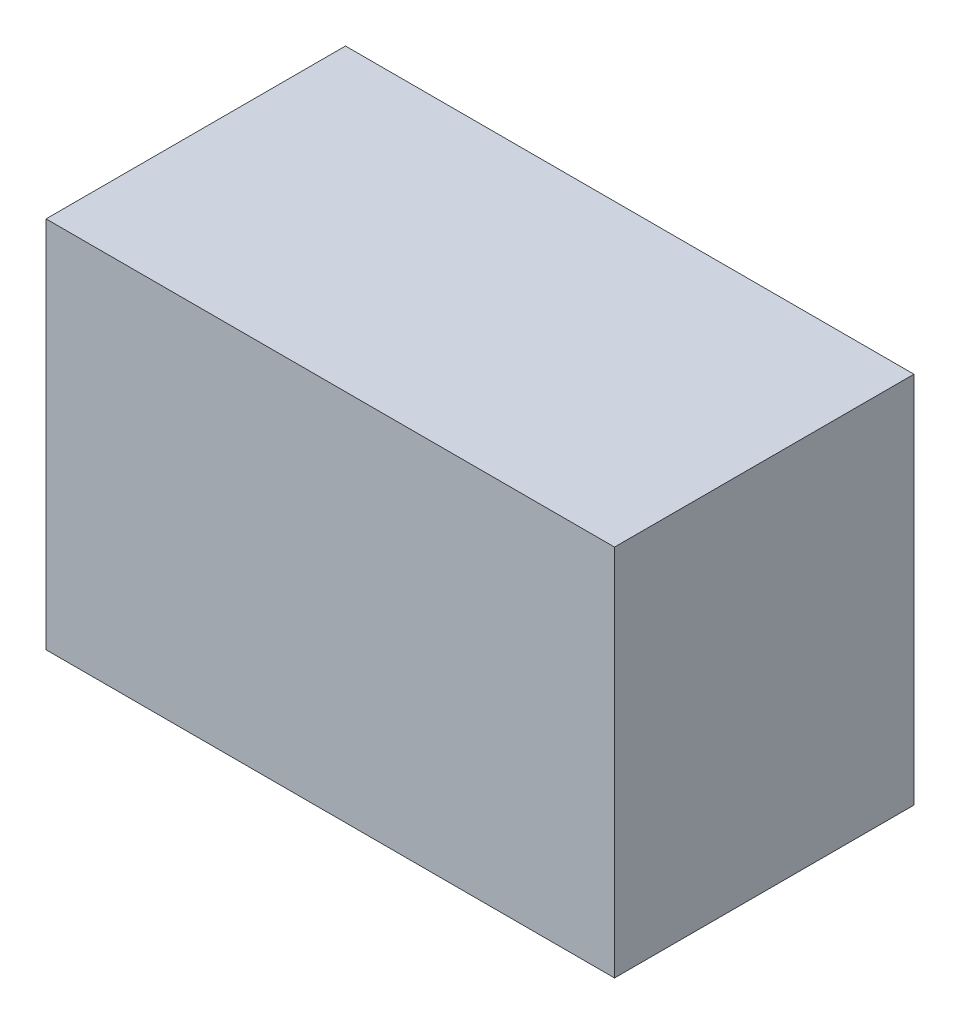
ISO-10303-21;
HEADER;
FILE_DESCRIPTION(('STEP AP214'),'2;1');
FILE_NAME('part.step','',(''),(''),'','','');
FILE_SCHEMA(('AUTOMOTIVE_DESIGN { 1 0 10303 214 1 1 1 1 }'));
ENDSEC;
DATA;
#1=APPLICATION_CONTEXT('core data for automotive mechanical design processes');
#2=APPLICATION_PROTOCOL_DEFINITION('international standard','automotive_design',2000,#1);
#3=PRODUCT_CONTEXT('',#1,'mechanical');
#4=PRODUCT('Part','Part','',(#3));
#5=PRODUCT_RELATED_PRODUCT_CATEGORY('part','',(#4));
#6=PRODUCT_DEFINITION_FORMATION('','',#4);
#7=PRODUCT_DEFINITION_CONTEXT('part definition',#1,'design');
#8=PRODUCT_DEFINITION('design','',#6,#7);
#9=PRODUCT_DEFINITION_SHAPE('','',#8);
#10=(LENGTH_UNIT() NAMED_UNIT(*) SI_UNIT(.MILLI.,.METRE.));
#11=(NAMED_UNIT(*) PLANE_ANGLE_UNIT() SI_UNIT($,.RADIAN.));
#12=(NAMED_UNIT(*) SI_UNIT($,.STERADIAN.) SOLID_ANGLE_UNIT());
#13=UNCERTAINTY_MEASURE_WITH_UNIT(LENGTH_MEASURE(1.E-05),#10,'distance_accuracy_value','');
#14=(GEOMETRIC_REPRESENTATION_CONTEXT(3) GLOBAL_UNCERTAINTY_ASSIGNED_CONTEXT((#13)) GLOBAL_UNIT_ASSIGNED_CONTEXT((#10,
#11,#12)) REPRESENTATION_CONTEXT('',''));
#15=CARTESIAN_POINT('',(0.,0.,0.));
#16=DIRECTION('',(0.,0.,1.));
#17=DIRECTION('',(1.,0.,0.));
#18=AXIS2_PLACEMENT_3D('',#15,#16,#17);
#19=CARTESIAN_POINT('',(166.37,218.44,-87.63));
#20=DIRECTION('',(-1.,0.,0.));
#21=DIRECTION('',(0.,0.,1.));
#22=AXIS2_PLACEMENT_3D('',#19,#20,#21);
#23=PLANE('',#22);
#24=DIRECTION('',(0.,0.,-1.));
#25=VECTOR('',#24,1.);
#26=CARTESIAN_POINT('',(166.37,0.,-87.63));
#27=LINE('',#26,#25);
#28=CARTESIAN_POINT('',(166.37,0.,87.63));
#29=VERTEX_POINT('',#28);
#30=CARTESIAN_POINT('',(166.37,0.,-87.63));
#31=VERTEX_POINT('',#30);
#32=EDGE_CURVE('E100',#29,#31,#27,.T.);
#33=ORIENTED_EDGE('',*,*,#32,.T.);
#34=DIRECTION('',(0.,-1.,0.));
#35=VECTOR('',#34,1.);
#36=CARTESIAN_POINT('',(166.37,218.44,-87.63));
#37=LINE('',#36,#35);
#38=CARTESIAN_POINT('',(166.37,218.44,-87.63));
#39=VERTEX_POINT('',#38);
#40=EDGE_CURVE('E11',#39,#31,#37,.T.);
#41=ORIENTED_EDGE('',*,*,#40,.F.);
#42=DIRECTION('',(0.,0.,-1.));
#43=VECTOR('',#42,1.);
#44=CARTESIAN_POINT('',(166.37,218.44,-87.63));
#45=LINE('',#44,#43);
#46=CARTESIAN_POINT('',(166.37,218.44,87.63));
#47=VERTEX_POINT('',#46);
#48=EDGE_CURVE('E88',#47,#39,#45,.T.);
#49=ORIENTED_EDGE('',*,*,#48,.F.);
#50=DIRECTION('',(0.,-1.,0.));
#51=VECTOR('',#50,1.);
#52=CARTESIAN_POINT('',(166.37,218.44,87.63));
#53=LINE('',#52,#51);
#54=EDGE_CURVE('E96',#47,#29,#53,.T.);
#55=ORIENTED_EDGE('',*,*,#54,.T.);
#56=EDGE_LOOP('',(#33,#41,#49,#55));
#57=FACE_BOUND('',#56,.T.);
#58=ADVANCED_FACE('F37',(#57),#23,.F.);
#59=CARTESIAN_POINT('',(-166.37,218.44,-87.63));
#60=DIRECTION('',(0.,0.,1.));
#61=DIRECTION('',(1.,0.,0.));
#62=AXIS2_PLACEMENT_3D('',#59,#60,#61);
#63=PLANE('',#62);
#64=DIRECTION('',(-1.,0.,0.));
#65=VECTOR('',#64,1.);
#66=CARTESIAN_POINT('',(-166.37,0.,-87.63));
#67=LINE('',#66,#65);
#68=CARTESIAN_POINT('',(-166.37,0.,-87.63));
#69=VERTEX_POINT('',#68);
#70=EDGE_CURVE('E92',#31,#69,#67,.T.);
#71=ORIENTED_EDGE('',*,*,#70,.T.);
#72=DIRECTION('',(0.,-1.,0.));
#73=VECTOR('',#72,1.);
#74=CARTESIAN_POINT('',(-166.37,218.44,-87.63));
#75=LINE('',#74,#73);
#76=CARTESIAN_POINT('',(-166.37,218.44,-87.63));
#77=VERTEX_POINT('',#76);
#78=EDGE_CURVE('E45',#77,#69,#75,.T.);
#79=ORIENTED_EDGE('',*,*,#78,.F.);
#80=DIRECTION('',(-1.,0.,0.));
#81=VECTOR('',#80,1.);
#82=CARTESIAN_POINT('',(-166.37,218.44,-87.63));
#83=LINE('',#82,#81);
#84=EDGE_CURVE('E83',#39,#77,#83,.T.);
#85=ORIENTED_EDGE('',*,*,#84,.F.);
#86=ORIENTED_EDGE('',*,*,#40,.T.);
#87=EDGE_LOOP('',(#71,#79,#85,#86));
#88=FACE_BOUND('',#87,.T.);
#89=ADVANCED_FACE('F91',(#88),#63,.F.);
#90=CARTESIAN_POINT('',(-166.37,218.44,-87.63));
#91=DIRECTION('',(1.,0.,0.));
#92=DIRECTION('',(0.,0.,-1.));
#93=AXIS2_PLACEMENT_3D('',#90,#91,#92);
#94=PLANE('',#93);
#95=DIRECTION('',(0.,0.,1.));
#96=VECTOR('',#95,1.);
#97=CARTESIAN_POINT('',(-166.37,0.,-87.63));
#98=LINE('',#97,#96);
#99=CARTESIAN_POINT('',(-166.37,0.,87.63));
#100=VERTEX_POINT('',#99);
#101=EDGE_CURVE('E70',#69,#100,#98,.T.);
#102=ORIENTED_EDGE('',*,*,#101,.T.);
#103=DIRECTION('',(0.,-1.,0.));
#104=VECTOR('',#103,1.);
#105=CARTESIAN_POINT('',(-166.37,218.44,87.63));
#106=LINE('',#105,#104);
#107=CARTESIAN_POINT('',(-166.37,218.44,87.63));
#108=VERTEX_POINT('',#107);
#109=EDGE_CURVE('E93',#108,#100,#106,.T.);
#110=ORIENTED_EDGE('',*,*,#109,.F.);
#111=DIRECTION('',(0.,0.,1.));
#112=VECTOR('',#111,1.);
#113=CARTESIAN_POINT('',(-166.37,218.44,-87.63));
#114=LINE('',#113,#112);
#115=EDGE_CURVE('E86',#77,#108,#114,.T.);
#116=ORIENTED_EDGE('',*,*,#115,.F.);
#117=ORIENTED_EDGE('',*,*,#78,.T.);
#118=EDGE_LOOP('',(#102,#110,#116,#117));
#119=FACE_BOUND('',#118,.T.);
#120=ADVANCED_FACE('F94',(#119),#94,.F.);
#121=CARTESIAN_POINT('',(-166.37,218.44,87.63));
#122=DIRECTION('',(0.,0.,-1.));
#123=DIRECTION('',(-1.,0.,0.));
#124=AXIS2_PLACEMENT_3D('',#121,#122,#123);
#125=PLANE('',#124);
#126=DIRECTION('',(1.,0.,0.));
#127=VECTOR('',#126,1.);
#128=CARTESIAN_POINT('',(-166.37,0.,87.63));
#129=LINE('',#128,#127);
#130=EDGE_CURVE('E76',#100,#29,#129,.T.);
#131=ORIENTED_EDGE('',*,*,#130,.T.);
#132=ORIENTED_EDGE('',*,*,#54,.F.);
#133=DIRECTION('',(1.,0.,0.));
#134=VECTOR('',#133,1.);
#135=CARTESIAN_POINT('',(-166.37,218.44,87.63));
#136=LINE('',#135,#134);
#137=EDGE_CURVE('E53',#108,#47,#136,.T.);
#138=ORIENTED_EDGE('',*,*,#137,.F.);
#139=ORIENTED_EDGE('',*,*,#109,.T.);
#140=EDGE_LOOP('',(#131,#132,#138,#139));
#141=FACE_BOUND('',#140,.T.);
#142=ADVANCED_FACE('F107',(#141),#125,.F.);
#143=CARTESIAN_POINT('',(0.,218.44,0.));
#144=DIRECTION('',(0.,1.,0.));
#145=DIRECTION('',(0.,0.,1.));
#146=AXIS2_PLACEMENT_3D('',#143,#144,#145);
#147=PLANE('',#146);
#148=ORIENTED_EDGE('',*,*,#48,.T.);
#149=ORIENTED_EDGE('',*,*,#84,.T.);
#150=ORIENTED_EDGE('',*,*,#115,.T.);
#151=ORIENTED_EDGE('',*,*,#137,.T.);
#152=EDGE_LOOP('',(#148,#149,#150,#151));
#153=FACE_BOUND('',#152,.T.);
#154=ADVANCED_FACE('F84',(#153),#147,.T.);
#155=CARTESIAN_POINT('',(0.,0.,0.));
#156=DIRECTION('',(0.,1.,0.));
#157=DIRECTION('',(0.,0.,1.));
#158=AXIS2_PLACEMENT_3D('',#155,#156,#157);
#159=PLANE('',#158);
#160=ORIENTED_EDGE('',*,*,#32,.F.);
#161=ORIENTED_EDGE('',*,*,#130,.F.);
#162=ORIENTED_EDGE('',*,*,#101,.F.);
#163=ORIENTED_EDGE('',*,*,#70,.F.);
#164=EDGE_LOOP('',(#160,#161,#162,#163));
#165=FACE_BOUND('',#164,.T.);
#166=ADVANCED_FACE('F110',(#165),#159,.F.);
#167=CLOSED_SHELL('',(#58,#89,#120,#142,#154,#166));
#168=MANIFOLD_SOLID_BREP('B2',#167);
#169=ADVANCED_BREP_SHAPE_REPRESENTATION('',(#18,#168),#14);
#170=SHAPE_DEFINITION_REPRESENTATION(#9,#169);
ENDSEC;
END-ISO-10303-21;
